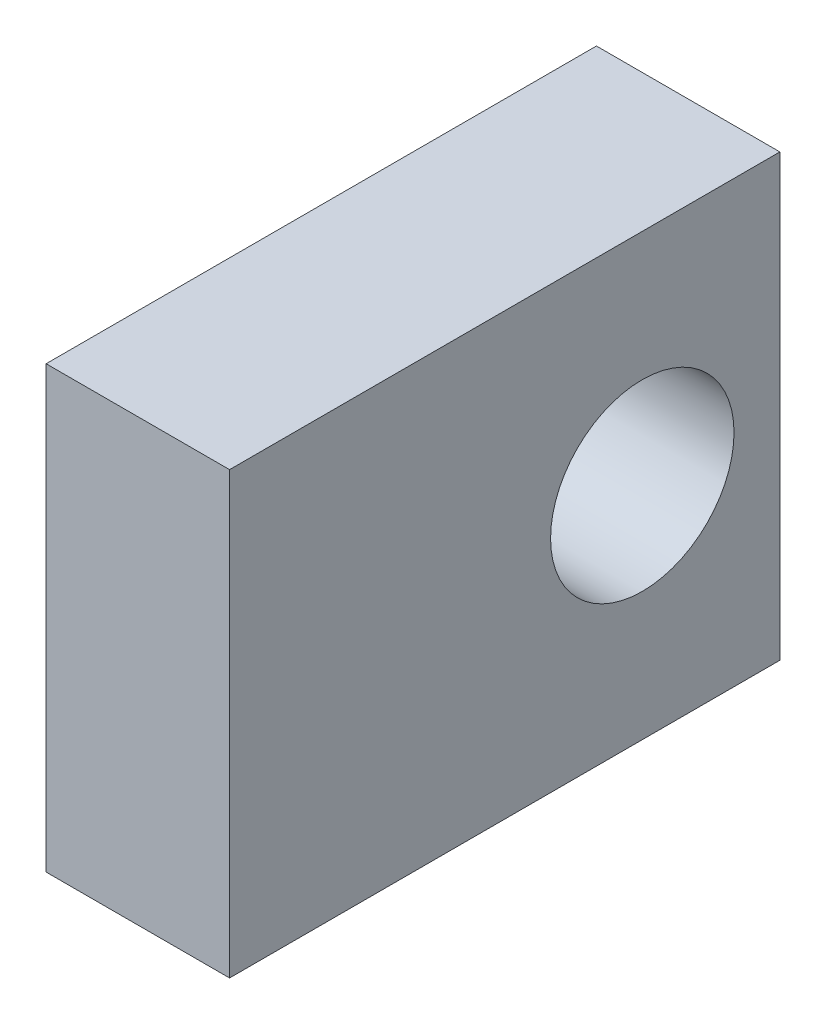
ISO-10303-21;
HEADER;
FILE_DESCRIPTION(('STEP AP214'),'2;1');
FILE_NAME('part.step','',(''),(''),'','','');
FILE_SCHEMA(('AUTOMOTIVE_DESIGN { 1 0 10303 214 1 1 1 1 }'));
ENDSEC;
DATA;
#1=APPLICATION_CONTEXT('core data for automotive mechanical design processes');
#2=APPLICATION_PROTOCOL_DEFINITION('international standard','automotive_design',2000,#1);
#3=PRODUCT_CONTEXT('',#1,'mechanical');
#4=PRODUCT('Part','Part','',(#3));
#5=PRODUCT_RELATED_PRODUCT_CATEGORY('part','',(#4));
#6=PRODUCT_DEFINITION_FORMATION('','',#4);
#7=PRODUCT_DEFINITION_CONTEXT('part definition',#1,'design');
#8=PRODUCT_DEFINITION('design','',#6,#7);
#9=PRODUCT_DEFINITION_SHAPE('','',#8);
#10=(LENGTH_UNIT() NAMED_UNIT(*) SI_UNIT(.MILLI.,.METRE.));
#11=(NAMED_UNIT(*) PLANE_ANGLE_UNIT() SI_UNIT($,.RADIAN.));
#12=(NAMED_UNIT(*) SI_UNIT($,.STERADIAN.) SOLID_ANGLE_UNIT());
#13=UNCERTAINTY_MEASURE_WITH_UNIT(LENGTH_MEASURE(1.E-05),#10,'distance_accuracy_value','');
#14=(GEOMETRIC_REPRESENTATION_CONTEXT(3) GLOBAL_UNCERTAINTY_ASSIGNED_CONTEXT((#13)) GLOBAL_UNIT_ASSIGNED_CONTEXT((#10,
#11,#12)) REPRESENTATION_CONTEXT('',''));
#15=CARTESIAN_POINT('',(0.,0.,0.));
#16=DIRECTION('',(0.,0.,1.));
#17=DIRECTION('',(1.,0.,0.));
#18=AXIS2_PLACEMENT_3D('',#15,#16,#17);
#19=CARTESIAN_POINT('',(12.7,0.,0.));
#20=DIRECTION('',(-1.,0.,0.));
#21=DIRECTION('',(0.,0.,1.));
#22=AXIS2_PLACEMENT_3D('',#19,#20,#21);
#23=PLANE('',#22);
#24=DIRECTION('',(0.,1.,0.));
#25=VECTOR('',#24,1.);
#26=CARTESIAN_POINT('',(12.7,-15.24,-19.05));
#27=LINE('',#26,#25);
#28=CARTESIAN_POINT('',(12.7,-15.24,-19.05));
#29=VERTEX_POINT('',#28);
#30=CARTESIAN_POINT('',(12.7,15.24,-19.05));
#31=VERTEX_POINT('',#30);
#32=EDGE_CURVE('E97',#29,#31,#27,.T.);
#33=ORIENTED_EDGE('',*,*,#32,.T.);
#34=DIRECTION('',(0.,0.,1.));
#35=VECTOR('',#34,1.);
#36=CARTESIAN_POINT('',(12.7,15.24,19.05));
#37=LINE('',#36,#35);
#38=CARTESIAN_POINT('',(12.7,15.24,19.05));
#39=VERTEX_POINT('',#38);
#40=EDGE_CURVE('E92',#31,#39,#37,.T.);
#41=ORIENTED_EDGE('',*,*,#40,.T.);
#42=DIRECTION('',(0.,-1.,0.));
#43=VECTOR('',#42,1.);
#44=CARTESIAN_POINT('',(12.7,-15.24,19.05));
#45=LINE('',#44,#43);
#46=CARTESIAN_POINT('',(12.7,-15.24,19.05));
#47=VERTEX_POINT('',#46);
#48=EDGE_CURVE('E95',#39,#47,#45,.T.);
#49=ORIENTED_EDGE('',*,*,#48,.T.);
#50=DIRECTION('',(0.,0.,-1.));
#51=VECTOR('',#50,1.);
#52=CARTESIAN_POINT('',(12.7,-15.24,19.05));
#53=LINE('',#52,#51);
#54=EDGE_CURVE('E62',#47,#29,#53,.T.);
#55=ORIENTED_EDGE('',*,*,#54,.T.);
#56=EDGE_LOOP('',(#33,#41,#49,#55));
#57=FACE_BOUND('',#56,.T.);
#58=CARTESIAN_POINT('',(12.7,0.,-9.525));
#59=DIRECTION('',(1.,0.,0.));
#60=DIRECTION('',(0.,0.,-1.));
#61=AXIS2_PLACEMENT_3D('',#58,#59,#60);
#62=CIRCLE('',#61,6.35);
#63=CARTESIAN_POINT('',(12.7,0.,-15.875));
#64=VERTEX_POINT('',#63);
#65=EDGE_CURVE('E112',#64,#64,#62,.T.);
#66=ORIENTED_EDGE('',*,*,#65,.F.);
#67=EDGE_LOOP('',(#66));
#68=FACE_BOUND('',#67,.T.);
#69=ADVANCED_FACE('F45',(#57,#68),#23,.F.);
#70=CARTESIAN_POINT('',(0.,0.,0.));
#71=DIRECTION('',(-1.,0.,0.));
#72=DIRECTION('',(0.,0.,1.));
#73=AXIS2_PLACEMENT_3D('',#70,#71,#72);
#74=PLANE('',#73);
#75=DIRECTION('',(0.,1.,0.));
#76=VECTOR('',#75,1.);
#77=CARTESIAN_POINT('',(0.,-15.24,-19.05));
#78=LINE('',#77,#76);
#79=CARTESIAN_POINT('',(0.,-15.24,-19.05));
#80=VERTEX_POINT('',#79);
#81=CARTESIAN_POINT('',(0.,15.24,-19.05));
#82=VERTEX_POINT('',#81);
#83=EDGE_CURVE('E109',#80,#82,#78,.T.);
#84=ORIENTED_EDGE('',*,*,#83,.F.);
#85=DIRECTION('',(0.,0.,-1.));
#86=VECTOR('',#85,1.);
#87=CARTESIAN_POINT('',(0.,-15.24,19.05));
#88=LINE('',#87,#86);
#89=CARTESIAN_POINT('',(0.,-15.24,19.05));
#90=VERTEX_POINT('',#89);
#91=EDGE_CURVE('E85',#90,#80,#88,.T.);
#92=ORIENTED_EDGE('',*,*,#91,.F.);
#93=DIRECTION('',(0.,-1.,0.));
#94=VECTOR('',#93,1.);
#95=CARTESIAN_POINT('',(0.,-15.24,19.05));
#96=LINE('',#95,#94);
#97=CARTESIAN_POINT('',(0.,15.24,19.05));
#98=VERTEX_POINT('',#97);
#99=EDGE_CURVE('E79',#98,#90,#96,.T.);
#100=ORIENTED_EDGE('',*,*,#99,.F.);
#101=DIRECTION('',(0.,0.,1.));
#102=VECTOR('',#101,1.);
#103=CARTESIAN_POINT('',(0.,15.24,19.05));
#104=LINE('',#103,#102);
#105=EDGE_CURVE('E101',#82,#98,#104,.T.);
#106=ORIENTED_EDGE('',*,*,#105,.F.);
#107=EDGE_LOOP('',(#84,#92,#100,#106));
#108=FACE_BOUND('',#107,.T.);
#109=CARTESIAN_POINT('',(0.,0.,-9.525));
#110=DIRECTION('',(1.,0.,0.));
#111=DIRECTION('',(0.,0.,-1.));
#112=AXIS2_PLACEMENT_3D('',#109,#110,#111);
#113=CIRCLE('',#112,6.35);
#114=CARTESIAN_POINT('',(0.,0.,-15.875));
#115=VERTEX_POINT('',#114);
#116=EDGE_CURVE('E124',#115,#115,#113,.T.);
#117=ORIENTED_EDGE('',*,*,#116,.T.);
#118=EDGE_LOOP('',(#117));
#119=FACE_BOUND('',#118,.T.);
#120=ADVANCED_FACE('F120',(#108,#119),#74,.T.);
#121=CARTESIAN_POINT('',(12.7,-15.24,-19.05));
#122=DIRECTION('',(0.,0.,1.));
#123=DIRECTION('',(1.,0.,0.));
#124=AXIS2_PLACEMENT_3D('',#121,#122,#123);
#125=PLANE('',#124);
#126=ORIENTED_EDGE('',*,*,#83,.T.);
#127=DIRECTION('',(-1.,0.,0.));
#128=VECTOR('',#127,1.);
#129=CARTESIAN_POINT('',(12.7,15.24,-19.05));
#130=LINE('',#129,#128);
#131=EDGE_CURVE('E13',#31,#82,#130,.T.);
#132=ORIENTED_EDGE('',*,*,#131,.F.);
#133=ORIENTED_EDGE('',*,*,#32,.F.);
#134=DIRECTION('',(-1.,0.,0.));
#135=VECTOR('',#134,1.);
#136=CARTESIAN_POINT('',(12.7,-15.24,-19.05));
#137=LINE('',#136,#135);
#138=EDGE_CURVE('E105',#29,#80,#137,.T.);
#139=ORIENTED_EDGE('',*,*,#138,.T.);
#140=EDGE_LOOP('',(#126,#132,#133,#139));
#141=FACE_BOUND('',#140,.T.);
#142=ADVANCED_FACE('F47',(#141),#125,.F.);
#143=CARTESIAN_POINT('',(12.7,15.24,19.05));
#144=DIRECTION('',(0.,-1.,0.));
#145=DIRECTION('',(0.,0.,-1.));
#146=AXIS2_PLACEMENT_3D('',#143,#144,#145);
#147=PLANE('',#146);
#148=ORIENTED_EDGE('',*,*,#105,.T.);
#149=DIRECTION('',(-1.,0.,0.));
#150=VECTOR('',#149,1.);
#151=CARTESIAN_POINT('',(12.7,15.24,19.05));
#152=LINE('',#151,#150);
#153=EDGE_CURVE('E54',#39,#98,#152,.T.);
#154=ORIENTED_EDGE('',*,*,#153,.F.);
#155=ORIENTED_EDGE('',*,*,#40,.F.);
#156=ORIENTED_EDGE('',*,*,#131,.T.);
#157=EDGE_LOOP('',(#148,#154,#155,#156));
#158=FACE_BOUND('',#157,.T.);
#159=ADVANCED_FACE('F100',(#158),#147,.F.);
#160=CARTESIAN_POINT('',(12.7,-15.24,19.05));
#161=DIRECTION('',(0.,0.,-1.));
#162=DIRECTION('',(-1.,0.,0.));
#163=AXIS2_PLACEMENT_3D('',#160,#161,#162);
#164=PLANE('',#163);
#165=ORIENTED_EDGE('',*,*,#99,.T.);
#166=DIRECTION('',(-1.,0.,0.));
#167=VECTOR('',#166,1.);
#168=CARTESIAN_POINT('',(12.7,-15.24,19.05));
#169=LINE('',#168,#167);
#170=EDGE_CURVE('E102',#47,#90,#169,.T.);
#171=ORIENTED_EDGE('',*,*,#170,.F.);
#172=ORIENTED_EDGE('',*,*,#48,.F.);
#173=ORIENTED_EDGE('',*,*,#153,.T.);
#174=EDGE_LOOP('',(#165,#171,#172,#173));
#175=FACE_BOUND('',#174,.T.);
#176=ADVANCED_FACE('F103',(#175),#164,.F.);
#177=CARTESIAN_POINT('',(12.7,-15.24,19.05));
#178=DIRECTION('',(0.,1.,0.));
#179=DIRECTION('',(0.,0.,1.));
#180=AXIS2_PLACEMENT_3D('',#177,#178,#179);
#181=PLANE('',#180);
#182=ORIENTED_EDGE('',*,*,#91,.T.);
#183=ORIENTED_EDGE('',*,*,#138,.F.);
#184=ORIENTED_EDGE('',*,*,#54,.F.);
#185=ORIENTED_EDGE('',*,*,#170,.T.);
#186=EDGE_LOOP('',(#182,#183,#184,#185));
#187=FACE_BOUND('',#186,.T.);
#188=ADVANCED_FACE('F117',(#187),#181,.F.);
#189=CARTESIAN_POINT('',(12.7,0.,-9.525));
#190=DIRECTION('',(-1.,0.,0.));
#191=DIRECTION('',(0.,0.,1.));
#192=AXIS2_PLACEMENT_3D('',#189,#190,#191);
#193=CYLINDRICAL_SURFACE('',#192,6.35);
#194=ORIENTED_EDGE('',*,*,#65,.T.);
#195=EDGE_LOOP('',(#194));
#196=FACE_BOUND('',#195,.T.);
#197=ORIENTED_EDGE('',*,*,#116,.F.);
#198=EDGE_LOOP('',(#197));
#199=FACE_BOUND('',#198,.T.);
#200=ADVANCED_FACE('F130',(#196,#199),#193,.F.);
#201=CLOSED_SHELL('',(#69,#120,#142,#159,#176,#188,#200));
#202=MANIFOLD_SOLID_BREP('B2',#201);
#203=ADVANCED_BREP_SHAPE_REPRESENTATION('',(#18,#202),#14);
#204=SHAPE_DEFINITION_REPRESENTATION(#9,#203);
ENDSEC;
END-ISO-10303-21;
